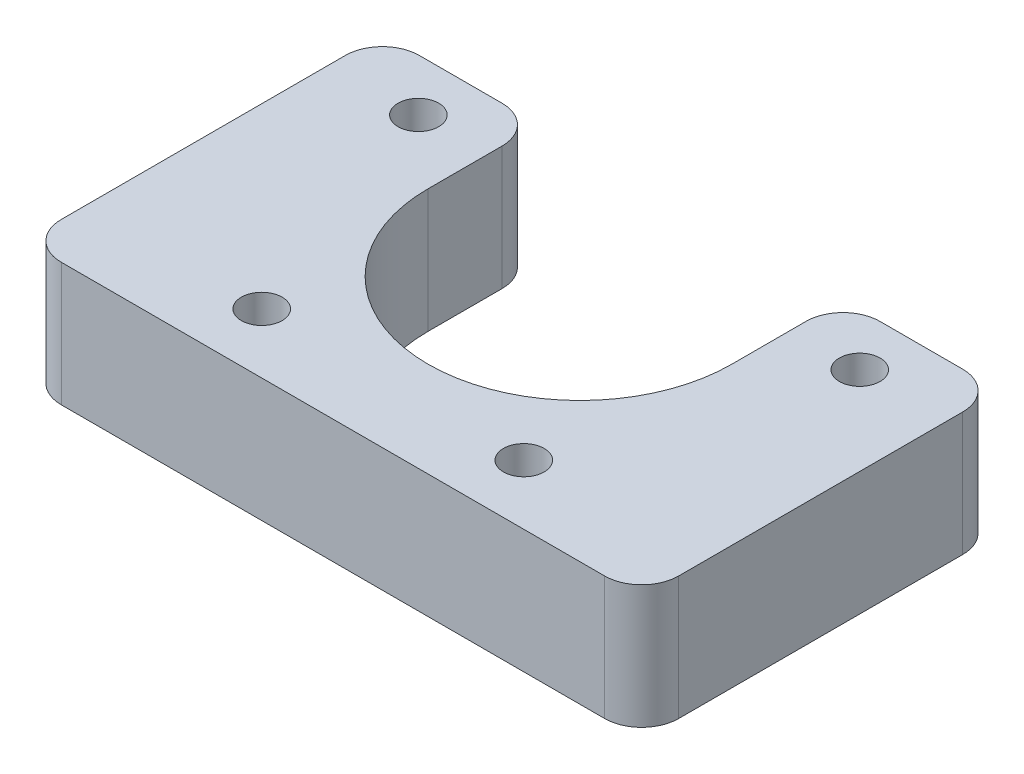
ISO-10303-21;
HEADER;
FILE_DESCRIPTION(('STEP AP214'),'2;1');
FILE_NAME('part.step','',(''),(''),'','','');
FILE_SCHEMA(('AUTOMOTIVE_DESIGN { 1 0 10303 214 1 1 1 1 }'));
ENDSEC;
DATA;
#1=APPLICATION_CONTEXT('core data for automotive mechanical design processes');
#2=APPLICATION_PROTOCOL_DEFINITION('international standard','automotive_design',2000,#1);
#3=PRODUCT_CONTEXT('',#1,'mechanical');
#4=PRODUCT('Part','Part','',(#3));
#5=PRODUCT_RELATED_PRODUCT_CATEGORY('part','',(#4));
#6=PRODUCT_DEFINITION_FORMATION('','',#4);
#7=PRODUCT_DEFINITION_CONTEXT('part definition',#1,'design');
#8=PRODUCT_DEFINITION('design','',#6,#7);
#9=PRODUCT_DEFINITION_SHAPE('','',#8);
#10=(LENGTH_UNIT() NAMED_UNIT(*) SI_UNIT(.MILLI.,.METRE.));
#11=(NAMED_UNIT(*) PLANE_ANGLE_UNIT() SI_UNIT($,.RADIAN.));
#12=(NAMED_UNIT(*) SI_UNIT($,.STERADIAN.) SOLID_ANGLE_UNIT());
#13=UNCERTAINTY_MEASURE_WITH_UNIT(LENGTH_MEASURE(1.E-05),#10,'distance_accuracy_value','');
#14=(GEOMETRIC_REPRESENTATION_CONTEXT(3) GLOBAL_UNCERTAINTY_ASSIGNED_CONTEXT((#13)) GLOBAL_UNIT_ASSIGNED_CONTEXT((#10,
#11,#12)) REPRESENTATION_CONTEXT('',''));
#15=CARTESIAN_POINT('',(0.,0.,0.));
#16=DIRECTION('',(0.,0.,1.));
#17=DIRECTION('',(1.,0.,0.));
#18=AXIS2_PLACEMENT_3D('',#15,#16,#17);
#19=CARTESIAN_POINT('',(0.,10.,-30.));
#20=DIRECTION('',(0.,1.,0.));
#21=DIRECTION('',(0.,0.,1.));
#22=AXIS2_PLACEMENT_3D('',#19,#20,#21);
#23=PLANE('',#22);
#24=CARTESIAN_POINT('',(10.6111640724944,10.,-14.8456871806537));
#25=DIRECTION('',(0.,1.,0.));
#26=DIRECTION('',(0.,0.,-1.));
#27=AXIS2_PLACEMENT_3D('',#24,#25,#26);
#28=CIRCLE('',#27,1.65);
#29=CARTESIAN_POINT('',(10.6111640724944,10.,-16.4956871806537));
#30=VERTEX_POINT('',#29);
#31=EDGE_CURVE('E283',#30,#30,#28,.T.);
#32=ORIENTED_EDGE('',*,*,#31,.F.);
#33=EDGE_LOOP('',(#32));
#34=FACE_BOUND('',#33,.T.);
#35=CARTESIAN_POINT('',(-10.6111640724944,10.,-14.8456871806537));
#36=DIRECTION('',(0.,1.,0.));
#37=DIRECTION('',(0.,0.,1.));
#38=AXIS2_PLACEMENT_3D('',#35,#36,#37);
#39=CIRCLE('',#38,1.65);
#40=CARTESIAN_POINT('',(-10.6111640724944,10.,-13.1956871806537));
#41=VERTEX_POINT('',#40);
#42=EDGE_CURVE('E186',#41,#41,#39,.T.);
#43=ORIENTED_EDGE('',*,*,#42,.F.);
#44=EDGE_LOOP('',(#43));
#45=FACE_BOUND('',#44,.T.);
#46=DIRECTION('',(0.,0.,1.));
#47=VECTOR('',#46,1.);
#48=CARTESIAN_POINT('',(-25.,10.,-39.));
#49=LINE('',#48,#47);
#50=CARTESIAN_POINT('',(-25.,10.,-36.));
#51=VERTEX_POINT('',#50);
#52=CARTESIAN_POINT('',(-25.,10.,-13.));
#53=VERTEX_POINT('',#52);
#54=EDGE_CURVE('E178',#51,#53,#49,.T.);
#55=ORIENTED_EDGE('',*,*,#54,.T.);
#56=CARTESIAN_POINT('',(-22.,10.,-13.));
#57=DIRECTION('',(0.,1.,0.));
#58=DIRECTION('',(0.,0.,1.));
#59=AXIS2_PLACEMENT_3D('',#56,#57,#58);
#60=CIRCLE('',#59,3.);
#61=CARTESIAN_POINT('',(-22.,10.,-9.99999999999998));
#62=VERTEX_POINT('',#61);
#63=EDGE_CURVE('E235',#53,#62,#60,.T.);
#64=ORIENTED_EDGE('',*,*,#63,.T.);
#65=DIRECTION('',(1.,0.,0.));
#66=VECTOR('',#65,1.);
#67=CARTESIAN_POINT('',(-25.,10.,-9.99999999999998));
#68=LINE('',#67,#66);
#69=CARTESIAN_POINT('',(22.,10.,-9.99999999999998));
#70=VERTEX_POINT('',#69);
#71=EDGE_CURVE('E180',#62,#70,#68,.T.);
#72=ORIENTED_EDGE('',*,*,#71,.T.);
#73=CARTESIAN_POINT('',(22.,10.,-13.));
#74=DIRECTION('',(0.,1.,0.));
#75=DIRECTION('',(0.,0.,1.));
#76=AXIS2_PLACEMENT_3D('',#73,#74,#75);
#77=CIRCLE('',#76,3.);
#78=CARTESIAN_POINT('',(25.,10.,-13.));
#79=VERTEX_POINT('',#78);
#80=EDGE_CURVE('E227',#70,#79,#77,.T.);
#81=ORIENTED_EDGE('',*,*,#80,.T.);
#82=DIRECTION('',(0.,0.,-1.));
#83=VECTOR('',#82,1.);
#84=CARTESIAN_POINT('',(25.,10.,-39.));
#85=LINE('',#84,#83);
#86=CARTESIAN_POINT('',(25.,10.,-36.));
#87=VERTEX_POINT('',#86);
#88=EDGE_CURVE('E204',#79,#87,#85,.T.);
#89=ORIENTED_EDGE('',*,*,#88,.T.);
#90=CARTESIAN_POINT('',(22.,10.,-36.));
#91=DIRECTION('',(0.,1.,0.));
#92=DIRECTION('',(0.,0.,1.));
#93=AXIS2_PLACEMENT_3D('',#90,#91,#92);
#94=CIRCLE('',#93,3.);
#95=CARTESIAN_POINT('',(22.,10.,-39.));
#96=VERTEX_POINT('',#95);
#97=EDGE_CURVE('E229',#87,#96,#94,.T.);
#98=ORIENTED_EDGE('',*,*,#97,.T.);
#99=DIRECTION('',(-1.,0.,0.));
#100=VECTOR('',#99,1.);
#101=CARTESIAN_POINT('',(12.3,10.,-39.));
#102=LINE('',#101,#100);
#103=CARTESIAN_POINT('',(15.3,10.,-39.));
#104=VERTEX_POINT('',#103);
#105=EDGE_CURVE('E156',#96,#104,#102,.T.);
#106=ORIENTED_EDGE('',*,*,#105,.T.);
#107=CARTESIAN_POINT('',(15.3,10.,-36.));
#108=DIRECTION('',(0.,1.,0.));
#109=DIRECTION('',(0.,0.,1.));
#110=AXIS2_PLACEMENT_3D('',#107,#108,#109);
#111=CIRCLE('',#110,3.);
#112=CARTESIAN_POINT('',(12.3,10.,-36.));
#113=VERTEX_POINT('',#112);
#114=EDGE_CURVE('E152',#104,#113,#111,.T.);
#115=ORIENTED_EDGE('',*,*,#114,.T.);
#116=DIRECTION('',(0.,0.,1.));
#117=VECTOR('',#116,1.);
#118=CARTESIAN_POINT('',(12.3,10.,-30.));
#119=LINE('',#118,#117);
#120=CARTESIAN_POINT('',(12.3,10.,-30.));
#121=VERTEX_POINT('',#120);
#122=EDGE_CURVE('E143',#113,#121,#119,.T.);
#123=ORIENTED_EDGE('',*,*,#122,.T.);
#124=CARTESIAN_POINT('',(0.,10.,-30.));
#125=DIRECTION('',(0.,-1.,0.));
#126=DIRECTION('',(0.,0.,1.));
#127=AXIS2_PLACEMENT_3D('',#124,#125,#126);
#128=CIRCLE('',#127,12.3);
#129=CARTESIAN_POINT('',(-12.3,10.,-30.));
#130=VERTEX_POINT('',#129);
#131=EDGE_CURVE('E148',#121,#130,#128,.T.);
#132=ORIENTED_EDGE('',*,*,#131,.T.);
#133=DIRECTION('',(0.,0.,-1.));
#134=VECTOR('',#133,1.);
#135=CARTESIAN_POINT('',(-12.3,10.,-30.));
#136=LINE('',#135,#134);
#137=CARTESIAN_POINT('',(-12.3,10.,-36.));
#138=VERTEX_POINT('',#137);
#139=EDGE_CURVE('E171',#130,#138,#136,.T.);
#140=ORIENTED_EDGE('',*,*,#139,.T.);
#141=CARTESIAN_POINT('',(-15.3,10.,-36.));
#142=DIRECTION('',(0.,1.,0.));
#143=DIRECTION('',(0.,0.,1.));
#144=AXIS2_PLACEMENT_3D('',#141,#142,#143);
#145=CIRCLE('',#144,3.);
#146=CARTESIAN_POINT('',(-15.3,10.,-39.));
#147=VERTEX_POINT('',#146);
#148=EDGE_CURVE('E65',#138,#147,#145,.T.);
#149=ORIENTED_EDGE('',*,*,#148,.T.);
#150=DIRECTION('',(-1.,0.,0.));
#151=VECTOR('',#150,1.);
#152=CARTESIAN_POINT('',(-12.3,10.,-39.));
#153=LINE('',#152,#151);
#154=CARTESIAN_POINT('',(-22.,10.,-39.));
#155=VERTEX_POINT('',#154);
#156=EDGE_CURVE('E173',#147,#155,#153,.T.);
#157=ORIENTED_EDGE('',*,*,#156,.T.);
#158=CARTESIAN_POINT('',(-22.,10.,-36.));
#159=DIRECTION('',(0.,1.,0.));
#160=DIRECTION('',(0.,0.,1.));
#161=AXIS2_PLACEMENT_3D('',#158,#159,#160);
#162=CIRCLE('',#161,3.);
#163=EDGE_CURVE('E233',#155,#51,#162,.T.);
#164=ORIENTED_EDGE('',*,*,#163,.T.);
#165=EDGE_LOOP('',(#55,#64,#72,#81,#89,#98,#106,#115,#123,#132,#140,#149,#157,#164));
#166=FACE_BOUND('',#165,.T.);
#167=CARTESIAN_POINT('',(-17.8696277863477,10.,-34.7881523343967));
#168=DIRECTION('',(0.,1.,0.));
#169=DIRECTION('',(0.,0.,1.));
#170=AXIS2_PLACEMENT_3D('',#167,#168,#169);
#171=CIRCLE('',#170,1.65);
#172=CARTESIAN_POINT('',(-17.8696277863477,10.,-33.1381523343967));
#173=VERTEX_POINT('',#172);
#174=EDGE_CURVE('E277',#173,#173,#171,.T.);
#175=ORIENTED_EDGE('',*,*,#174,.F.);
#176=EDGE_LOOP('',(#175));
#177=FACE_BOUND('',#176,.T.);
#178=CARTESIAN_POINT('',(17.8696277863477,10.,-34.7881523343967));
#179=DIRECTION('',(0.,1.,0.));
#180=DIRECTION('',(0.,0.,-1.));
#181=AXIS2_PLACEMENT_3D('',#178,#179,#180);
#182=CIRCLE('',#181,1.65);
#183=CARTESIAN_POINT('',(17.8696277863477,10.,-36.4381523343967));
#184=VERTEX_POINT('',#183);
#185=EDGE_CURVE('E289',#184,#184,#182,.T.);
#186=ORIENTED_EDGE('',*,*,#185,.F.);
#187=EDGE_LOOP('',(#186));
#188=FACE_BOUND('',#187,.T.);
#189=ADVANCED_FACE('F43',(#34,#45,#166,#177,#188),#23,.T.);
#190=CARTESIAN_POINT('',(0.,0.,-30.));
#191=DIRECTION('',(0.,1.,0.));
#192=DIRECTION('',(0.,0.,1.));
#193=AXIS2_PLACEMENT_3D('',#190,#191,#192);
#194=PLANE('',#193);
#195=DIRECTION('',(1.,0.,0.));
#196=VECTOR('',#195,1.);
#197=CARTESIAN_POINT('',(-25.,0.,-9.99999999999998));
#198=LINE('',#197,#196);
#199=CARTESIAN_POINT('',(-22.,0.,-9.99999999999998));
#200=VERTEX_POINT('',#199);
#201=CARTESIAN_POINT('',(22.,0.,-9.99999999999998));
#202=VERTEX_POINT('',#201);
#203=EDGE_CURVE('E198',#200,#202,#198,.T.);
#204=ORIENTED_EDGE('',*,*,#203,.F.);
#205=CARTESIAN_POINT('',(-22.,0.,-13.));
#206=DIRECTION('',(0.,1.,0.));
#207=DIRECTION('',(0.,0.,1.));
#208=AXIS2_PLACEMENT_3D('',#205,#206,#207);
#209=CIRCLE('',#208,3.);
#210=CARTESIAN_POINT('',(-25.,0.,-13.));
#211=VERTEX_POINT('',#210);
#212=EDGE_CURVE('E220',#200,#211,#209,.F.);
#213=ORIENTED_EDGE('',*,*,#212,.T.);
#214=DIRECTION('',(0.,0.,1.));
#215=VECTOR('',#214,1.);
#216=CARTESIAN_POINT('',(-25.,0.,-30.));
#217=LINE('',#216,#215);
#218=CARTESIAN_POINT('',(-25.,0.,-36.));
#219=VERTEX_POINT('',#218);
#220=EDGE_CURVE('E195',#219,#211,#217,.T.);
#221=ORIENTED_EDGE('',*,*,#220,.F.);
#222=CARTESIAN_POINT('',(-22.,0.,-36.));
#223=DIRECTION('',(0.,1.,0.));
#224=DIRECTION('',(0.,0.,1.));
#225=AXIS2_PLACEMENT_3D('',#222,#223,#224);
#226=CIRCLE('',#225,3.);
#227=CARTESIAN_POINT('',(-22.,0.,-39.));
#228=VERTEX_POINT('',#227);
#229=EDGE_CURVE('E218',#219,#228,#226,.F.);
#230=ORIENTED_EDGE('',*,*,#229,.T.);
#231=DIRECTION('',(-1.,0.,0.));
#232=VECTOR('',#231,1.);
#233=CARTESIAN_POINT('',(-12.3,0.,-39.));
#234=LINE('',#233,#232);
#235=CARTESIAN_POINT('',(-15.3,0.,-39.));
#236=VERTEX_POINT('',#235);
#237=EDGE_CURVE('E193',#236,#228,#234,.T.);
#238=ORIENTED_EDGE('',*,*,#237,.F.);
#239=CARTESIAN_POINT('',(-15.3,0.,-36.));
#240=DIRECTION('',(0.,1.,0.));
#241=DIRECTION('',(0.,0.,1.));
#242=AXIS2_PLACEMENT_3D('',#239,#240,#241);
#243=CIRCLE('',#242,3.);
#244=CARTESIAN_POINT('',(-12.3,0.,-36.));
#245=VERTEX_POINT('',#244);
#246=EDGE_CURVE('E216',#236,#245,#243,.F.);
#247=ORIENTED_EDGE('',*,*,#246,.T.);
#248=DIRECTION('',(0.,0.,-1.));
#249=VECTOR('',#248,1.);
#250=CARTESIAN_POINT('',(-12.3,0.,-30.));
#251=LINE('',#250,#249);
#252=CARTESIAN_POINT('',(-12.3,0.,-30.));
#253=VERTEX_POINT('',#252);
#254=EDGE_CURVE('E190',#253,#245,#251,.T.);
#255=ORIENTED_EDGE('',*,*,#254,.F.);
#256=CARTESIAN_POINT('',(0.,0.,-30.));
#257=DIRECTION('',(0.,-1.,0.));
#258=DIRECTION('',(0.,0.,1.));
#259=AXIS2_PLACEMENT_3D('',#256,#257,#258);
#260=CIRCLE('',#259,12.3);
#261=CARTESIAN_POINT('',(12.3,0.,-30.));
#262=VERTEX_POINT('',#261);
#263=EDGE_CURVE('E188',#262,#253,#260,.T.);
#264=ORIENTED_EDGE('',*,*,#263,.F.);
#265=DIRECTION('',(0.,0.,1.));
#266=VECTOR('',#265,1.);
#267=CARTESIAN_POINT('',(12.3,0.,-30.));
#268=LINE('',#267,#266);
#269=CARTESIAN_POINT('',(12.3,0.,-36.));
#270=VERTEX_POINT('',#269);
#271=EDGE_CURVE('E162',#270,#262,#268,.T.);
#272=ORIENTED_EDGE('',*,*,#271,.F.);
#273=CARTESIAN_POINT('',(15.3,0.,-36.));
#274=DIRECTION('',(0.,1.,0.));
#275=DIRECTION('',(0.,0.,1.));
#276=AXIS2_PLACEMENT_3D('',#273,#274,#275);
#277=CIRCLE('',#276,3.);
#278=CARTESIAN_POINT('',(15.3,0.,-39.));
#279=VERTEX_POINT('',#278);
#280=EDGE_CURVE('E214',#270,#279,#277,.F.);
#281=ORIENTED_EDGE('',*,*,#280,.T.);
#282=DIRECTION('',(-1.,0.,0.));
#283=VECTOR('',#282,1.);
#284=CARTESIAN_POINT('',(12.3,0.,-39.));
#285=LINE('',#284,#283);
#286=CARTESIAN_POINT('',(22.,0.,-39.));
#287=VERTEX_POINT('',#286);
#288=EDGE_CURVE('E183',#287,#279,#285,.T.);
#289=ORIENTED_EDGE('',*,*,#288,.F.);
#290=CARTESIAN_POINT('',(22.,0.,-36.));
#291=DIRECTION('',(0.,1.,0.));
#292=DIRECTION('',(0.,0.,1.));
#293=AXIS2_PLACEMENT_3D('',#290,#291,#292);
#294=CIRCLE('',#293,3.);
#295=CARTESIAN_POINT('',(25.,0.,-36.));
#296=VERTEX_POINT('',#295);
#297=EDGE_CURVE('E212',#287,#296,#294,.F.);
#298=ORIENTED_EDGE('',*,*,#297,.T.);
#299=DIRECTION('',(0.,0.,-1.));
#300=VECTOR('',#299,1.);
#301=CARTESIAN_POINT('',(25.,0.,-9.99999999999998));
#302=LINE('',#301,#300);
#303=CARTESIAN_POINT('',(25.,0.,-13.));
#304=VERTEX_POINT('',#303);
#305=EDGE_CURVE('E201',#304,#296,#302,.T.);
#306=ORIENTED_EDGE('',*,*,#305,.F.);
#307=CARTESIAN_POINT('',(22.,0.,-13.));
#308=DIRECTION('',(0.,1.,0.));
#309=DIRECTION('',(0.,0.,1.));
#310=AXIS2_PLACEMENT_3D('',#307,#308,#309);
#311=CIRCLE('',#310,3.);
#312=EDGE_CURVE('E210',#304,#202,#311,.F.);
#313=ORIENTED_EDGE('',*,*,#312,.T.);
#314=EDGE_LOOP('',(#204,#213,#221,#230,#238,#247,#255,#264,#272,#281,#289,#298,#306,#313));
#315=FACE_BOUND('',#314,.T.);
#316=CARTESIAN_POINT('',(-10.6111640724944,0.,-14.8456871806537));
#317=DIRECTION('',(0.,1.,0.));
#318=DIRECTION('',(0.,0.,1.));
#319=AXIS2_PLACEMENT_3D('',#316,#317,#318);
#320=CIRCLE('',#319,1.65);
#321=CARTESIAN_POINT('',(-10.6111640724944,0.,-13.1956871806537));
#322=VERTEX_POINT('',#321);
#323=EDGE_CURVE('E274',#322,#322,#320,.T.);
#324=ORIENTED_EDGE('',*,*,#323,.T.);
#325=EDGE_LOOP('',(#324));
#326=FACE_BOUND('',#325,.T.);
#327=CARTESIAN_POINT('',(-17.8696277863477,0.,-34.7881523343967));
#328=DIRECTION('',(0.,1.,0.));
#329=DIRECTION('',(0.,0.,1.));
#330=AXIS2_PLACEMENT_3D('',#327,#328,#329);
#331=CIRCLE('',#330,1.65);
#332=CARTESIAN_POINT('',(-17.8696277863477,0.,-33.1381523343967));
#333=VERTEX_POINT('',#332);
#334=EDGE_CURVE('E280',#333,#333,#331,.T.);
#335=ORIENTED_EDGE('',*,*,#334,.T.);
#336=EDGE_LOOP('',(#335));
#337=FACE_BOUND('',#336,.T.);
#338=CARTESIAN_POINT('',(10.6111640724944,0.,-14.8456871806537));
#339=DIRECTION('',(0.,1.,0.));
#340=DIRECTION('',(0.,0.,-1.));
#341=AXIS2_PLACEMENT_3D('',#338,#339,#340);
#342=CIRCLE('',#341,1.65);
#343=CARTESIAN_POINT('',(10.6111640724944,0.,-16.4956871806537));
#344=VERTEX_POINT('',#343);
#345=EDGE_CURVE('E286',#344,#344,#342,.T.);
#346=ORIENTED_EDGE('',*,*,#345,.T.);
#347=EDGE_LOOP('',(#346));
#348=FACE_BOUND('',#347,.T.);
#349=CARTESIAN_POINT('',(17.8696277863477,0.,-34.7881523343967));
#350=DIRECTION('',(0.,1.,0.));
#351=DIRECTION('',(0.,0.,-1.));
#352=AXIS2_PLACEMENT_3D('',#349,#350,#351);
#353=CIRCLE('',#352,1.65);
#354=CARTESIAN_POINT('',(17.8696277863477,0.,-36.4381523343967));
#355=VERTEX_POINT('',#354);
#356=EDGE_CURVE('E292',#355,#355,#353,.T.);
#357=ORIENTED_EDGE('',*,*,#356,.T.);
#358=EDGE_LOOP('',(#357));
#359=FACE_BOUND('',#358,.T.);
#360=ADVANCED_FACE('F261',(#315,#326,#337,#348,#359),#194,.F.);
#361=CARTESIAN_POINT('',(12.3,10.,-39.));
#362=DIRECTION('',(0.,0.,1.));
#363=DIRECTION('',(1.,0.,0.));
#364=AXIS2_PLACEMENT_3D('',#361,#362,#363);
#365=PLANE('',#364);
#366=ORIENTED_EDGE('',*,*,#288,.T.);
#367=DIRECTION('',(0.,-1.,0.));
#368=VECTOR('',#367,1.);
#369=CARTESIAN_POINT('',(15.3,10.,-39.));
#370=LINE('',#369,#368);
#371=EDGE_CURVE('E248',#279,#104,#370,.F.);
#372=ORIENTED_EDGE('',*,*,#371,.T.);
#373=ORIENTED_EDGE('',*,*,#105,.F.);
#374=DIRECTION('',(0.,-1.,0.));
#375=VECTOR('',#374,1.);
#376=CARTESIAN_POINT('',(22.,10.,-39.));
#377=LINE('',#376,#375);
#378=EDGE_CURVE('E245',#96,#287,#377,.T.);
#379=ORIENTED_EDGE('',*,*,#378,.T.);
#380=EDGE_LOOP('',(#366,#372,#373,#379));
#381=FACE_BOUND('',#380,.T.);
#382=ADVANCED_FACE('F270',(#381),#365,.F.);
#383=CARTESIAN_POINT('',(12.3,10.,-30.));
#384=DIRECTION('',(1.,0.,0.));
#385=DIRECTION('',(0.,0.,-1.));
#386=AXIS2_PLACEMENT_3D('',#383,#384,#385);
#387=PLANE('',#386);
#388=ORIENTED_EDGE('',*,*,#122,.F.);
#389=DIRECTION('',(0.,-1.,0.));
#390=VECTOR('',#389,1.);
#391=CARTESIAN_POINT('',(12.3,10.,-36.));
#392=LINE('',#391,#390);
#393=EDGE_CURVE('E243',#113,#270,#392,.T.);
#394=ORIENTED_EDGE('',*,*,#393,.T.);
#395=ORIENTED_EDGE('',*,*,#271,.T.);
#396=DIRECTION('',(0.,-1.,0.));
#397=VECTOR('',#396,1.);
#398=CARTESIAN_POINT('',(12.3,10.,-30.));
#399=LINE('',#398,#397);
#400=EDGE_CURVE('E159',#121,#262,#399,.T.);
#401=ORIENTED_EDGE('',*,*,#400,.F.);
#402=EDGE_LOOP('',(#388,#394,#395,#401));
#403=FACE_BOUND('',#402,.T.);
#404=ADVANCED_FACE('F160',(#403),#387,.F.);
#405=CARTESIAN_POINT('',(0.,10.,-30.));
#406=DIRECTION('',(0.,-1.,0.));
#407=DIRECTION('',(0.,0.,-1.));
#408=AXIS2_PLACEMENT_3D('',#405,#406,#407);
#409=CYLINDRICAL_SURFACE('',#408,12.3);
#410=ORIENTED_EDGE('',*,*,#263,.T.);
#411=DIRECTION('',(0.,-1.,0.));
#412=VECTOR('',#411,1.);
#413=CARTESIAN_POINT('',(-12.3,10.,-30.));
#414=LINE('',#413,#412);
#415=EDGE_CURVE('E166',#130,#253,#414,.T.);
#416=ORIENTED_EDGE('',*,*,#415,.F.);
#417=ORIENTED_EDGE('',*,*,#131,.F.);
#418=ORIENTED_EDGE('',*,*,#400,.T.);
#419=EDGE_LOOP('',(#410,#416,#417,#418));
#420=FACE_BOUND('',#419,.T.);
#421=ADVANCED_FACE('F168',(#420),#409,.F.);
#422=CARTESIAN_POINT('',(-12.3,10.,-30.));
#423=DIRECTION('',(-1.,0.,0.));
#424=DIRECTION('',(0.,0.,1.));
#425=AXIS2_PLACEMENT_3D('',#422,#423,#424);
#426=PLANE('',#425);
#427=ORIENTED_EDGE('',*,*,#254,.T.);
#428=DIRECTION('',(0.,-1.,0.));
#429=VECTOR('',#428,1.);
#430=CARTESIAN_POINT('',(-12.3,10.,-36.));
#431=LINE('',#430,#429);
#432=EDGE_CURVE('E241',#245,#138,#431,.F.);
#433=ORIENTED_EDGE('',*,*,#432,.T.);
#434=ORIENTED_EDGE('',*,*,#139,.F.);
#435=ORIENTED_EDGE('',*,*,#415,.T.);
#436=EDGE_LOOP('',(#427,#433,#434,#435));
#437=FACE_BOUND('',#436,.T.);
#438=ADVANCED_FACE('F328',(#437),#426,.F.);
#439=CARTESIAN_POINT('',(-12.3,10.,-39.));
#440=DIRECTION('',(0.,0.,1.));
#441=DIRECTION('',(1.,0.,0.));
#442=AXIS2_PLACEMENT_3D('',#439,#440,#441);
#443=PLANE('',#442);
#444=ORIENTED_EDGE('',*,*,#237,.T.);
#445=DIRECTION('',(0.,-1.,0.));
#446=VECTOR('',#445,1.);
#447=CARTESIAN_POINT('',(-22.,10.,-39.));
#448=LINE('',#447,#446);
#449=EDGE_CURVE('E58',#228,#155,#448,.F.);
#450=ORIENTED_EDGE('',*,*,#449,.T.);
#451=ORIENTED_EDGE('',*,*,#156,.F.);
#452=DIRECTION('',(0.,-1.,0.));
#453=VECTOR('',#452,1.);
#454=CARTESIAN_POINT('',(-15.3,10.,-39.));
#455=LINE('',#454,#453);
#456=EDGE_CURVE('E237',#147,#236,#455,.T.);
#457=ORIENTED_EDGE('',*,*,#456,.T.);
#458=EDGE_LOOP('',(#444,#450,#451,#457));
#459=FACE_BOUND('',#458,.T.);
#460=ADVANCED_FACE('F324',(#459),#443,.F.);
#461=CARTESIAN_POINT('',(-25.,10.,-30.));
#462=DIRECTION('',(1.,0.,0.));
#463=DIRECTION('',(0.,0.,-1.));
#464=AXIS2_PLACEMENT_3D('',#461,#462,#463);
#465=PLANE('',#464);
#466=ORIENTED_EDGE('',*,*,#220,.T.);
#467=DIRECTION('',(0.,-1.,0.));
#468=VECTOR('',#467,1.);
#469=CARTESIAN_POINT('',(-25.,10.,-13.));
#470=LINE('',#469,#468);
#471=EDGE_CURVE('E225',#211,#53,#470,.F.);
#472=ORIENTED_EDGE('',*,*,#471,.T.);
#473=ORIENTED_EDGE('',*,*,#54,.F.);
#474=DIRECTION('',(0.,-1.,0.));
#475=VECTOR('',#474,1.);
#476=CARTESIAN_POINT('',(-25.,10.,-36.));
#477=LINE('',#476,#475);
#478=EDGE_CURVE('E222',#51,#219,#477,.T.);
#479=ORIENTED_EDGE('',*,*,#478,.T.);
#480=EDGE_LOOP('',(#466,#472,#473,#479));
#481=FACE_BOUND('',#480,.T.);
#482=ADVANCED_FACE('F320',(#481),#465,.F.);
#483=CARTESIAN_POINT('',(-25.,10.,-9.99999999999998));
#484=DIRECTION('',(0.,0.,-1.));
#485=DIRECTION('',(-1.,0.,0.));
#486=AXIS2_PLACEMENT_3D('',#483,#484,#485);
#487=PLANE('',#486);
#488=ORIENTED_EDGE('',*,*,#71,.F.);
#489=DIRECTION('',(0.,-1.,0.));
#490=VECTOR('',#489,1.);
#491=CARTESIAN_POINT('',(-22.,10.,-9.99999999999998));
#492=LINE('',#491,#490);
#493=EDGE_CURVE('E207',#62,#200,#492,.T.);
#494=ORIENTED_EDGE('',*,*,#493,.T.);
#495=ORIENTED_EDGE('',*,*,#203,.T.);
#496=DIRECTION('',(0.,-1.,0.));
#497=VECTOR('',#496,1.);
#498=CARTESIAN_POINT('',(22.,10.,-9.99999999999998));
#499=LINE('',#498,#497);
#500=EDGE_CURVE('E165',#202,#70,#499,.F.);
#501=ORIENTED_EDGE('',*,*,#500,.T.);
#502=EDGE_LOOP('',(#488,#494,#495,#501));
#503=FACE_BOUND('',#502,.T.);
#504=ADVANCED_FACE('F317',(#503),#487,.F.);
#505=CARTESIAN_POINT('',(25.,10.,-9.99999999999998));
#506=DIRECTION('',(-1.,0.,0.));
#507=DIRECTION('',(0.,0.,1.));
#508=AXIS2_PLACEMENT_3D('',#505,#506,#507);
#509=PLANE('',#508);
#510=ORIENTED_EDGE('',*,*,#305,.T.);
#511=DIRECTION('',(0.,-1.,0.));
#512=VECTOR('',#511,1.);
#513=CARTESIAN_POINT('',(25.,10.,-36.));
#514=LINE('',#513,#512);
#515=EDGE_CURVE('E11',#296,#87,#514,.F.);
#516=ORIENTED_EDGE('',*,*,#515,.T.);
#517=ORIENTED_EDGE('',*,*,#88,.F.);
#518=DIRECTION('',(0.,-1.,0.));
#519=VECTOR('',#518,1.);
#520=CARTESIAN_POINT('',(25.,10.,-13.));
#521=LINE('',#520,#519);
#522=EDGE_CURVE('E51',#79,#304,#521,.T.);
#523=ORIENTED_EDGE('',*,*,#522,.T.);
#524=EDGE_LOOP('',(#510,#516,#517,#523));
#525=FACE_BOUND('',#524,.T.);
#526=ADVANCED_FACE('F254',(#525),#509,.F.);
#527=CARTESIAN_POINT('',(-10.6111640724944,10.,-14.8456871806537));
#528=DIRECTION('',(0.,-1.,0.));
#529=DIRECTION('',(0.,0.,-1.));
#530=AXIS2_PLACEMENT_3D('',#527,#528,#529);
#531=CYLINDRICAL_SURFACE('',#530,1.65);
#532=ORIENTED_EDGE('',*,*,#42,.T.);
#533=EDGE_LOOP('',(#532));
#534=FACE_BOUND('',#533,.T.);
#535=ORIENTED_EDGE('',*,*,#323,.F.);
#536=EDGE_LOOP('',(#535));
#537=FACE_BOUND('',#536,.T.);
#538=ADVANCED_FACE('F312',(#534,#537),#531,.F.);
#539=CARTESIAN_POINT('',(-17.8696277863477,10.,-34.7881523343967));
#540=DIRECTION('',(0.,-1.,0.));
#541=DIRECTION('',(0.,0.,-1.));
#542=AXIS2_PLACEMENT_3D('',#539,#540,#541);
#543=CYLINDRICAL_SURFACE('',#542,1.65);
#544=ORIENTED_EDGE('',*,*,#174,.T.);
#545=EDGE_LOOP('',(#544));
#546=FACE_BOUND('',#545,.T.);
#547=ORIENTED_EDGE('',*,*,#334,.F.);
#548=EDGE_LOOP('',(#547));
#549=FACE_BOUND('',#548,.T.);
#550=ADVANCED_FACE('F418',(#546,#549),#543,.F.);
#551=CARTESIAN_POINT('',(10.6111640724944,10.,-14.8456871806537));
#552=DIRECTION('',(0.,-1.,0.));
#553=DIRECTION('',(0.,0.,-1.));
#554=AXIS2_PLACEMENT_3D('',#551,#552,#553);
#555=CYLINDRICAL_SURFACE('',#554,1.65);
#556=ORIENTED_EDGE('',*,*,#31,.T.);
#557=EDGE_LOOP('',(#556));
#558=FACE_BOUND('',#557,.T.);
#559=ORIENTED_EDGE('',*,*,#345,.F.);
#560=EDGE_LOOP('',(#559));
#561=FACE_BOUND('',#560,.T.);
#562=ADVANCED_FACE('F409',(#558,#561),#555,.F.);
#563=CARTESIAN_POINT('',(17.8696277863477,10.,-34.7881523343967));
#564=DIRECTION('',(0.,-1.,0.));
#565=DIRECTION('',(0.,0.,-1.));
#566=AXIS2_PLACEMENT_3D('',#563,#564,#565);
#567=CYLINDRICAL_SURFACE('',#566,1.65);
#568=ORIENTED_EDGE('',*,*,#185,.T.);
#569=EDGE_LOOP('',(#568));
#570=FACE_BOUND('',#569,.T.);
#571=ORIENTED_EDGE('',*,*,#356,.F.);
#572=EDGE_LOOP('',(#571));
#573=FACE_BOUND('',#572,.T.);
#574=ADVANCED_FACE('F298',(#570,#573),#567,.F.);
#575=CARTESIAN_POINT('',(-22.,10.,-13.));
#576=DIRECTION('',(0.,-1.,0.));
#577=DIRECTION('',(0.,0.,-1.));
#578=AXIS2_PLACEMENT_3D('',#575,#576,#577);
#579=CYLINDRICAL_SURFACE('',#578,3.);
#580=ORIENTED_EDGE('',*,*,#63,.F.);
#581=ORIENTED_EDGE('',*,*,#471,.F.);
#582=ORIENTED_EDGE('',*,*,#212,.F.);
#583=ORIENTED_EDGE('',*,*,#493,.F.);
#584=EDGE_LOOP('',(#580,#581,#582,#583));
#585=FACE_BOUND('',#584,.T.);
#586=ADVANCED_FACE('F338',(#585),#579,.T.);
#587=CARTESIAN_POINT('',(-22.,10.,-36.));
#588=DIRECTION('',(0.,-1.,0.));
#589=DIRECTION('',(0.,0.,-1.));
#590=AXIS2_PLACEMENT_3D('',#587,#588,#589);
#591=CYLINDRICAL_SURFACE('',#590,3.);
#592=ORIENTED_EDGE('',*,*,#163,.F.);
#593=ORIENTED_EDGE('',*,*,#449,.F.);
#594=ORIENTED_EDGE('',*,*,#229,.F.);
#595=ORIENTED_EDGE('',*,*,#478,.F.);
#596=EDGE_LOOP('',(#592,#593,#594,#595));
#597=FACE_BOUND('',#596,.T.);
#598=ADVANCED_FACE('F341',(#597),#591,.T.);
#599=CARTESIAN_POINT('',(-15.3,10.,-36.));
#600=DIRECTION('',(0.,-1.,0.));
#601=DIRECTION('',(0.,0.,-1.));
#602=AXIS2_PLACEMENT_3D('',#599,#600,#601);
#603=CYLINDRICAL_SURFACE('',#602,3.);
#604=ORIENTED_EDGE('',*,*,#148,.F.);
#605=ORIENTED_EDGE('',*,*,#432,.F.);
#606=ORIENTED_EDGE('',*,*,#246,.F.);
#607=ORIENTED_EDGE('',*,*,#456,.F.);
#608=EDGE_LOOP('',(#604,#605,#606,#607));
#609=FACE_BOUND('',#608,.T.);
#610=ADVANCED_FACE('F345',(#609),#603,.T.);
#611=CARTESIAN_POINT('',(15.3,10.,-36.));
#612=DIRECTION('',(0.,-1.,0.));
#613=DIRECTION('',(0.,0.,-1.));
#614=AXIS2_PLACEMENT_3D('',#611,#612,#613);
#615=CYLINDRICAL_SURFACE('',#614,3.);
#616=ORIENTED_EDGE('',*,*,#114,.F.);
#617=ORIENTED_EDGE('',*,*,#371,.F.);
#618=ORIENTED_EDGE('',*,*,#280,.F.);
#619=ORIENTED_EDGE('',*,*,#393,.F.);
#620=EDGE_LOOP('',(#616,#617,#618,#619));
#621=FACE_BOUND('',#620,.T.);
#622=ADVANCED_FACE('F349',(#621),#615,.T.);
#623=CARTESIAN_POINT('',(22.,10.,-36.));
#624=DIRECTION('',(0.,-1.,0.));
#625=DIRECTION('',(0.,0.,-1.));
#626=AXIS2_PLACEMENT_3D('',#623,#624,#625);
#627=CYLINDRICAL_SURFACE('',#626,3.);
#628=ORIENTED_EDGE('',*,*,#97,.F.);
#629=ORIENTED_EDGE('',*,*,#515,.F.);
#630=ORIENTED_EDGE('',*,*,#297,.F.);
#631=ORIENTED_EDGE('',*,*,#378,.F.);
#632=EDGE_LOOP('',(#628,#629,#630,#631));
#633=FACE_BOUND('',#632,.T.);
#634=ADVANCED_FACE('F267',(#633),#627,.T.);
#635=CARTESIAN_POINT('',(22.,10.,-13.));
#636=DIRECTION('',(0.,-1.,0.));
#637=DIRECTION('',(0.,0.,-1.));
#638=AXIS2_PLACEMENT_3D('',#635,#636,#637);
#639=CYLINDRICAL_SURFACE('',#638,3.);
#640=ORIENTED_EDGE('',*,*,#80,.F.);
#641=ORIENTED_EDGE('',*,*,#500,.F.);
#642=ORIENTED_EDGE('',*,*,#312,.F.);
#643=ORIENTED_EDGE('',*,*,#522,.F.);
#644=EDGE_LOOP('',(#640,#641,#642,#643));
#645=FACE_BOUND('',#644,.T.);
#646=ADVANCED_FACE('F45',(#645),#639,.T.);
#647=CLOSED_SHELL('',(#189,#360,#382,#404,#421,#438,#460,#482,#504,#526,#538,#550,#562,#574,
#586,#598,#610,#622,#634,#646));
#648=MANIFOLD_SOLID_BREP('B2',#647);
#649=ADVANCED_BREP_SHAPE_REPRESENTATION('',(#18,#648),#14);
#650=SHAPE_DEFINITION_REPRESENTATION(#9,#649);
ENDSEC;
END-ISO-10303-21;
